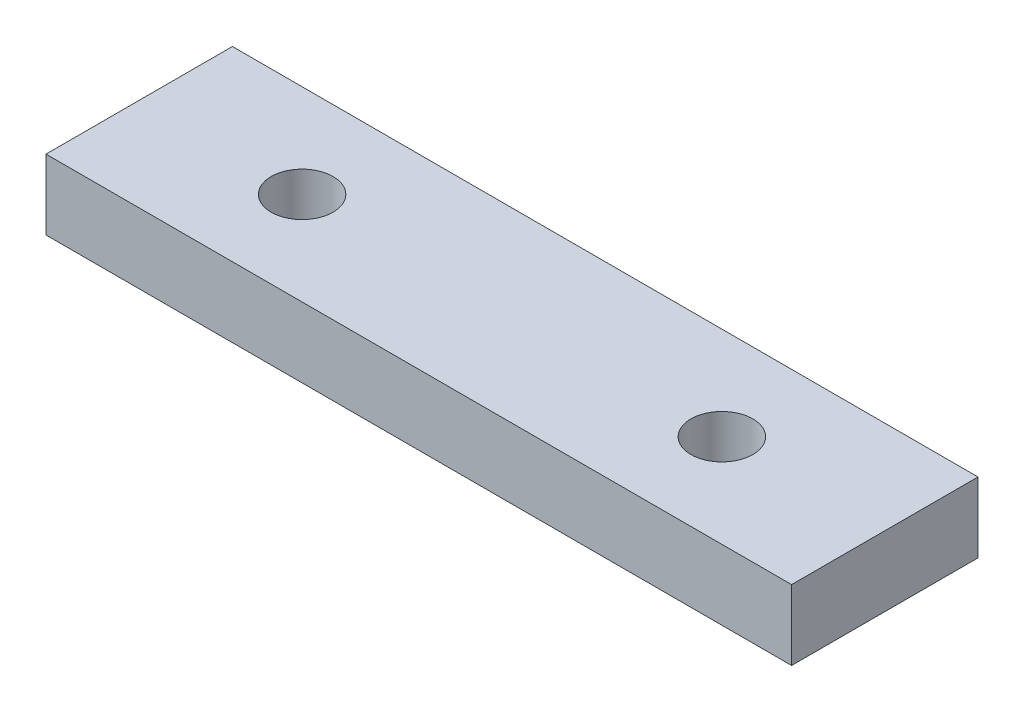
ISO-10303-21;
HEADER;
FILE_DESCRIPTION(('STEP AP214'),'2;1');
FILE_NAME('part.step','',(''),(''),'','','');
FILE_SCHEMA(('AUTOMOTIVE_DESIGN { 1 0 10303 214 1 1 1 1 }'));
ENDSEC;
DATA;
#1=APPLICATION_CONTEXT('core data for automotive mechanical design processes');
#2=APPLICATION_PROTOCOL_DEFINITION('international standard','automotive_design',2000,#1);
#3=PRODUCT_CONTEXT('',#1,'mechanical');
#4=PRODUCT('Part','Part','',(#3));
#5=PRODUCT_RELATED_PRODUCT_CATEGORY('part','',(#4));
#6=PRODUCT_DEFINITION_FORMATION('','',#4);
#7=PRODUCT_DEFINITION_CONTEXT('part definition',#1,'design');
#8=PRODUCT_DEFINITION('design','',#6,#7);
#9=PRODUCT_DEFINITION_SHAPE('','',#8);
#10=(LENGTH_UNIT() NAMED_UNIT(*) SI_UNIT(.MILLI.,.METRE.));
#11=(NAMED_UNIT(*) PLANE_ANGLE_UNIT() SI_UNIT($,.RADIAN.));
#12=(NAMED_UNIT(*) SI_UNIT($,.STERADIAN.) SOLID_ANGLE_UNIT());
#13=UNCERTAINTY_MEASURE_WITH_UNIT(LENGTH_MEASURE(1.E-05),#10,'distance_accuracy_value','');
#14=(GEOMETRIC_REPRESENTATION_CONTEXT(3) GLOBAL_UNCERTAINTY_ASSIGNED_CONTEXT((#13)) GLOBAL_UNIT_ASSIGNED_CONTEXT((#10,
#11,#12)) REPRESENTATION_CONTEXT('',''));
#15=CARTESIAN_POINT('',(0.,0.,0.));
#16=DIRECTION('',(0.,0.,1.));
#17=DIRECTION('',(1.,0.,0.));
#18=AXIS2_PLACEMENT_3D('',#15,#16,#17);
#19=CARTESIAN_POINT('',(-25.4,4.7752,0.));
#20=DIRECTION('',(0.,1.,0.));
#21=DIRECTION('',(0.,0.,1.));
#22=AXIS2_PLACEMENT_3D('',#19,#20,#21);
#23=PLANE('',#22);
#24=CARTESIAN_POINT('',(14.3002,4.7752,-6.35));
#25=DIRECTION('',(0.,1.,0.));
#26=DIRECTION('',(0.,0.,1.));
#27=AXIS2_PLACEMENT_3D('',#24,#25,#26);
#28=CIRCLE('',#27,2.1082);
#29=CARTESIAN_POINT('',(14.3002,4.7752,-4.2418));
#30=VERTEX_POINT('',#29);
#31=EDGE_CURVE('E103',#30,#30,#28,.T.);
#32=ORIENTED_EDGE('',*,*,#31,.F.);
#33=EDGE_LOOP('',(#32));
#34=FACE_BOUND('',#33,.T.);
#35=DIRECTION('',(0.,0.,1.));
#36=VECTOR('',#35,1.);
#37=CARTESIAN_POINT('',(-25.4,4.7752,-12.7));
#38=LINE('',#37,#36);
#39=CARTESIAN_POINT('',(-25.4,4.7752,-12.7));
#40=VERTEX_POINT('',#39);
#41=CARTESIAN_POINT('',(-25.4,4.7752,0.));
#42=VERTEX_POINT('',#41);
#43=EDGE_CURVE('E88',#40,#42,#38,.T.);
#44=ORIENTED_EDGE('',*,*,#43,.T.);
#45=DIRECTION('',(1.,0.,0.));
#46=VECTOR('',#45,1.);
#47=CARTESIAN_POINT('',(-25.4,4.7752,0.));
#48=LINE('',#47,#46);
#49=CARTESIAN_POINT('',(25.4,4.7752,0.));
#50=VERTEX_POINT('',#49);
#51=EDGE_CURVE('E83',#42,#50,#48,.T.);
#52=ORIENTED_EDGE('',*,*,#51,.T.);
#53=DIRECTION('',(0.,0.,-1.));
#54=VECTOR('',#53,1.);
#55=CARTESIAN_POINT('',(25.4,4.7752,-12.7));
#56=LINE('',#55,#54);
#57=CARTESIAN_POINT('',(25.4,4.7752,-12.7));
#58=VERTEX_POINT('',#57);
#59=EDGE_CURVE('E86',#50,#58,#56,.T.);
#60=ORIENTED_EDGE('',*,*,#59,.T.);
#61=DIRECTION('',(-1.,0.,0.));
#62=VECTOR('',#61,1.);
#63=CARTESIAN_POINT('',(-25.4,4.7752,-12.7));
#64=LINE('',#63,#62);
#65=EDGE_CURVE('E53',#58,#40,#64,.T.);
#66=ORIENTED_EDGE('',*,*,#65,.T.);
#67=EDGE_LOOP('',(#44,#52,#60,#66));
#68=FACE_BOUND('',#67,.T.);
#69=CARTESIAN_POINT('',(-14.3002,4.7752,-6.35));
#70=DIRECTION('',(0.,1.,0.));
#71=DIRECTION('',(0.,0.,1.));
#72=AXIS2_PLACEMENT_3D('',#69,#70,#71);
#73=CIRCLE('',#72,2.1082);
#74=CARTESIAN_POINT('',(-14.3002,4.7752,-4.2418));
#75=VERTEX_POINT('',#74);
#76=EDGE_CURVE('E118',#75,#75,#73,.T.);
#77=ORIENTED_EDGE('',*,*,#76,.F.);
#78=EDGE_LOOP('',(#77));
#79=FACE_BOUND('',#78,.T.);
#80=ADVANCED_FACE('F36',(#34,#68,#79),#23,.T.);
#81=CARTESIAN_POINT('',(-25.4,0.,0.));
#82=DIRECTION('',(0.,1.,0.));
#83=DIRECTION('',(0.,0.,1.));
#84=AXIS2_PLACEMENT_3D('',#81,#82,#83);
#85=PLANE('',#84);
#86=CARTESIAN_POINT('',(14.3002,0.,-6.35));
#87=DIRECTION('',(0.,1.,0.));
#88=DIRECTION('',(0.,0.,1.));
#89=AXIS2_PLACEMENT_3D('',#86,#87,#88);
#90=CIRCLE('',#89,2.1082);
#91=CARTESIAN_POINT('',(14.3002,0.,-4.2418));
#92=VERTEX_POINT('',#91);
#93=EDGE_CURVE('E115',#92,#92,#90,.T.);
#94=ORIENTED_EDGE('',*,*,#93,.T.);
#95=EDGE_LOOP('',(#94));
#96=FACE_BOUND('',#95,.T.);
#97=DIRECTION('',(0.,0.,1.));
#98=VECTOR('',#97,1.);
#99=CARTESIAN_POINT('',(-25.4,0.,-12.7));
#100=LINE('',#99,#98);
#101=CARTESIAN_POINT('',(-25.4,0.,-12.7));
#102=VERTEX_POINT('',#101);
#103=CARTESIAN_POINT('',(-25.4,0.,0.));
#104=VERTEX_POINT('',#103);
#105=EDGE_CURVE('E100',#102,#104,#100,.T.);
#106=ORIENTED_EDGE('',*,*,#105,.F.);
#107=DIRECTION('',(-1.,0.,0.));
#108=VECTOR('',#107,1.);
#109=CARTESIAN_POINT('',(-25.4,0.,-12.7));
#110=LINE('',#109,#108);
#111=CARTESIAN_POINT('',(25.4,0.,-12.7));
#112=VERTEX_POINT('',#111);
#113=EDGE_CURVE('E76',#112,#102,#110,.T.);
#114=ORIENTED_EDGE('',*,*,#113,.F.);
#115=DIRECTION('',(0.,0.,-1.));
#116=VECTOR('',#115,1.);
#117=CARTESIAN_POINT('',(25.4,0.,-12.7));
#118=LINE('',#117,#116);
#119=CARTESIAN_POINT('',(25.4,0.,0.));
#120=VERTEX_POINT('',#119);
#121=EDGE_CURVE('E70',#120,#112,#118,.T.);
#122=ORIENTED_EDGE('',*,*,#121,.F.);
#123=DIRECTION('',(1.,0.,0.));
#124=VECTOR('',#123,1.);
#125=CARTESIAN_POINT('',(-25.4,0.,0.));
#126=LINE('',#125,#124);
#127=EDGE_CURVE('E92',#104,#120,#126,.T.);
#128=ORIENTED_EDGE('',*,*,#127,.F.);
#129=EDGE_LOOP('',(#106,#114,#122,#128));
#130=FACE_BOUND('',#129,.T.);
#131=CARTESIAN_POINT('',(-14.3002,0.,-6.35));
#132=DIRECTION('',(0.,1.,0.));
#133=DIRECTION('',(0.,0.,1.));
#134=AXIS2_PLACEMENT_3D('',#131,#132,#133);
#135=CIRCLE('',#134,2.1082);
#136=CARTESIAN_POINT('',(-14.3002,0.,-4.2418));
#137=VERTEX_POINT('',#136);
#138=EDGE_CURVE('E121',#137,#137,#135,.T.);
#139=ORIENTED_EDGE('',*,*,#138,.T.);
#140=EDGE_LOOP('',(#139));
#141=FACE_BOUND('',#140,.T.);
#142=ADVANCED_FACE('F111',(#96,#130,#141),#85,.F.);
#143=CARTESIAN_POINT('',(-25.4,4.7752,-12.7));
#144=DIRECTION('',(1.,0.,0.));
#145=DIRECTION('',(0.,0.,-1.));
#146=AXIS2_PLACEMENT_3D('',#143,#144,#145);
#147=PLANE('',#146);
#148=ORIENTED_EDGE('',*,*,#105,.T.);
#149=DIRECTION('',(0.,-1.,0.));
#150=VECTOR('',#149,1.);
#151=CARTESIAN_POINT('',(-25.4,4.7752,0.));
#152=LINE('',#151,#150);
#153=EDGE_CURVE('E11',#42,#104,#152,.T.);
#154=ORIENTED_EDGE('',*,*,#153,.F.);
#155=ORIENTED_EDGE('',*,*,#43,.F.);
#156=DIRECTION('',(0.,-1.,0.));
#157=VECTOR('',#156,1.);
#158=CARTESIAN_POINT('',(-25.4,4.7752,-12.7));
#159=LINE('',#158,#157);
#160=EDGE_CURVE('E96',#40,#102,#159,.T.);
#161=ORIENTED_EDGE('',*,*,#160,.T.);
#162=EDGE_LOOP('',(#148,#154,#155,#161));
#163=FACE_BOUND('',#162,.T.);
#164=ADVANCED_FACE('F38',(#163),#147,.F.);
#165=CARTESIAN_POINT('',(-25.4,4.7752,0.));
#166=DIRECTION('',(0.,0.,-1.));
#167=DIRECTION('',(-1.,0.,0.));
#168=AXIS2_PLACEMENT_3D('',#165,#166,#167);
#169=PLANE('',#168);
#170=ORIENTED_EDGE('',*,*,#127,.T.);
#171=DIRECTION('',(0.,-1.,0.));
#172=VECTOR('',#171,1.);
#173=CARTESIAN_POINT('',(25.4,4.7752,0.));
#174=LINE('',#173,#172);
#175=EDGE_CURVE('E45',#50,#120,#174,.T.);
#176=ORIENTED_EDGE('',*,*,#175,.F.);
#177=ORIENTED_EDGE('',*,*,#51,.F.);
#178=ORIENTED_EDGE('',*,*,#153,.T.);
#179=EDGE_LOOP('',(#170,#176,#177,#178));
#180=FACE_BOUND('',#179,.T.);
#181=ADVANCED_FACE('F91',(#180),#169,.F.);
#182=CARTESIAN_POINT('',(25.4,4.7752,-12.7));
#183=DIRECTION('',(-1.,0.,0.));
#184=DIRECTION('',(0.,0.,1.));
#185=AXIS2_PLACEMENT_3D('',#182,#183,#184);
#186=PLANE('',#185);
#187=ORIENTED_EDGE('',*,*,#121,.T.);
#188=DIRECTION('',(0.,-1.,0.));
#189=VECTOR('',#188,1.);
#190=CARTESIAN_POINT('',(25.4,4.7752,-12.7));
#191=LINE('',#190,#189);
#192=EDGE_CURVE('E93',#58,#112,#191,.T.);
#193=ORIENTED_EDGE('',*,*,#192,.F.);
#194=ORIENTED_EDGE('',*,*,#59,.F.);
#195=ORIENTED_EDGE('',*,*,#175,.T.);
#196=EDGE_LOOP('',(#187,#193,#194,#195));
#197=FACE_BOUND('',#196,.T.);
#198=ADVANCED_FACE('F94',(#197),#186,.F.);
#199=CARTESIAN_POINT('',(-25.4,4.7752,-12.7));
#200=DIRECTION('',(0.,0.,1.));
#201=DIRECTION('',(1.,0.,0.));
#202=AXIS2_PLACEMENT_3D('',#199,#200,#201);
#203=PLANE('',#202);
#204=ORIENTED_EDGE('',*,*,#113,.T.);
#205=ORIENTED_EDGE('',*,*,#160,.F.);
#206=ORIENTED_EDGE('',*,*,#65,.F.);
#207=ORIENTED_EDGE('',*,*,#192,.T.);
#208=EDGE_LOOP('',(#204,#205,#206,#207));
#209=FACE_BOUND('',#208,.T.);
#210=ADVANCED_FACE('F108',(#209),#203,.F.);
#211=CARTESIAN_POINT('',(14.3002,4.7752,-6.35));
#212=DIRECTION('',(0.,-1.,0.));
#213=DIRECTION('',(0.,0.,-1.));
#214=AXIS2_PLACEMENT_3D('',#211,#212,#213);
#215=CYLINDRICAL_SURFACE('',#214,2.1082);
#216=ORIENTED_EDGE('',*,*,#31,.T.);
#217=EDGE_LOOP('',(#216));
#218=FACE_BOUND('',#217,.T.);
#219=ORIENTED_EDGE('',*,*,#93,.F.);
#220=EDGE_LOOP('',(#219));
#221=FACE_BOUND('',#220,.T.);
#222=ADVANCED_FACE('F139',(#218,#221),#215,.F.);
#223=CARTESIAN_POINT('',(-14.3002,4.7752,-6.35));
#224=DIRECTION('',(0.,-1.,0.));
#225=DIRECTION('',(0.,0.,-1.));
#226=AXIS2_PLACEMENT_3D('',#223,#224,#225);
#227=CYLINDRICAL_SURFACE('',#226,2.1082);
#228=ORIENTED_EDGE('',*,*,#76,.T.);
#229=EDGE_LOOP('',(#228));
#230=FACE_BOUND('',#229,.T.);
#231=ORIENTED_EDGE('',*,*,#138,.F.);
#232=EDGE_LOOP('',(#231));
#233=FACE_BOUND('',#232,.T.);
#234=ADVANCED_FACE('F127',(#230,#233),#227,.F.);
#235=CLOSED_SHELL('',(#80,#142,#164,#181,#198,#210,#222,#234));
#236=MANIFOLD_SOLID_BREP('B2',#235);
#237=ADVANCED_BREP_SHAPE_REPRESENTATION('',(#18,#236),#14);
#238=SHAPE_DEFINITION_REPRESENTATION(#9,#237);
ENDSEC;
END-ISO-10303-21;
